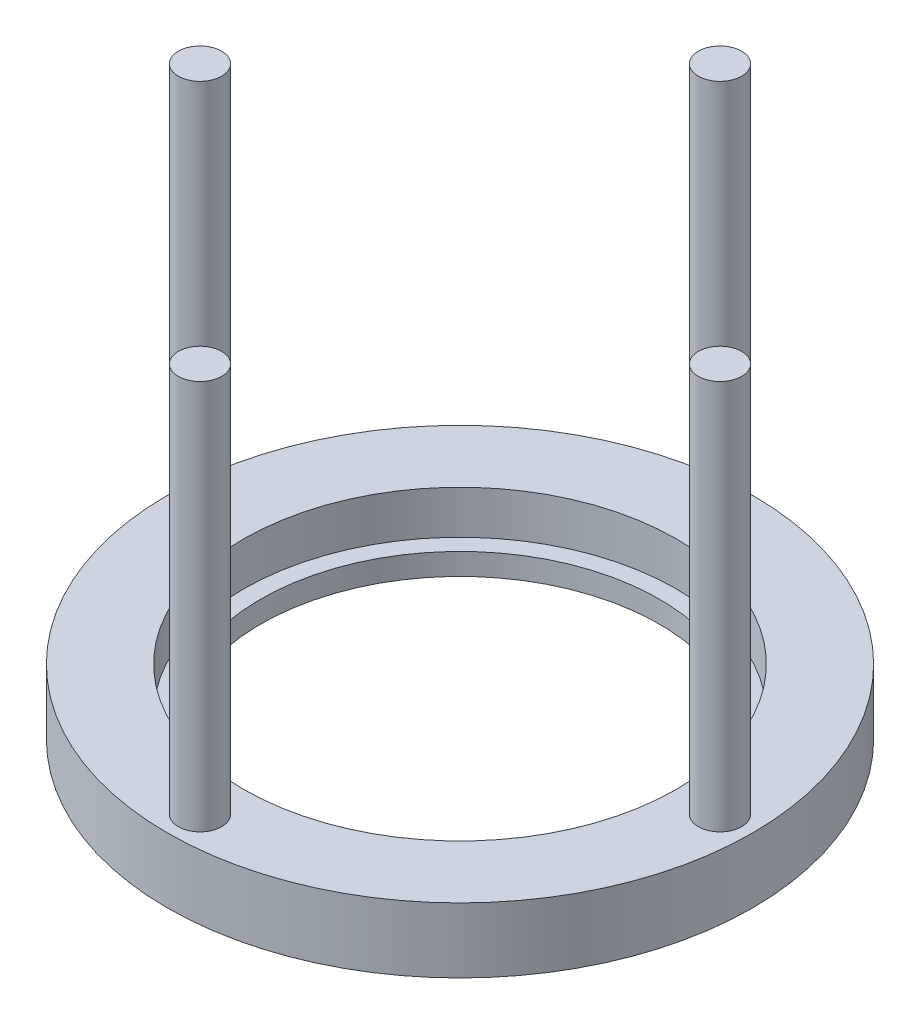
ISO-10303-21;
HEADER;
FILE_DESCRIPTION(('STEP AP214'),'2;1');
FILE_NAME('part.step','',(''),(''),'','','');
FILE_SCHEMA(('AUTOMOTIVE_DESIGN { 1 0 10303 214 1 1 1 1 }'));
ENDSEC;
DATA;
#1=APPLICATION_CONTEXT('core data for automotive mechanical design processes');
#2=APPLICATION_PROTOCOL_DEFINITION('international standard','automotive_design',2000,#1);
#3=PRODUCT_CONTEXT('',#1,'mechanical');
#4=PRODUCT('Part','Part','',(#3));
#5=PRODUCT_RELATED_PRODUCT_CATEGORY('part','',(#4));
#6=PRODUCT_DEFINITION_FORMATION('','',#4);
#7=PRODUCT_DEFINITION_CONTEXT('part definition',#1,'design');
#8=PRODUCT_DEFINITION('design','',#6,#7);
#9=PRODUCT_DEFINITION_SHAPE('','',#8);
#10=(LENGTH_UNIT() NAMED_UNIT(*) SI_UNIT(.MILLI.,.METRE.));
#11=(NAMED_UNIT(*) PLANE_ANGLE_UNIT() SI_UNIT($,.RADIAN.));
#12=(NAMED_UNIT(*) SI_UNIT($,.STERADIAN.) SOLID_ANGLE_UNIT());
#13=UNCERTAINTY_MEASURE_WITH_UNIT(LENGTH_MEASURE(1.E-05),#10,'distance_accuracy_value','');
#14=(GEOMETRIC_REPRESENTATION_CONTEXT(3) GLOBAL_UNCERTAINTY_ASSIGNED_CONTEXT((#13)) GLOBAL_UNIT_ASSIGNED_CONTEXT((#10,
#11,#12)) REPRESENTATION_CONTEXT('',''));
#15=CARTESIAN_POINT('',(0.,0.,0.));
#16=DIRECTION('',(0.,0.,1.));
#17=DIRECTION('',(1.,0.,0.));
#18=AXIS2_PLACEMENT_3D('',#15,#16,#17);
#19=CARTESIAN_POINT('',(0.,7.5,0.));
#20=DIRECTION('',(0.,-1.,0.));
#21=DIRECTION('',(0.,0.,-1.));
#22=AXIS2_PLACEMENT_3D('',#19,#20,#21);
#23=CYLINDRICAL_SURFACE('',#22,33.75);
#24=CARTESIAN_POINT('',(0.,7.5,0.));
#25=DIRECTION('',(0.,1.,0.));
#26=DIRECTION('',(0.,0.,1.));
#27=AXIS2_PLACEMENT_3D('',#24,#25,#26);
#28=CIRCLE('',#27,33.75);
#29=CARTESIAN_POINT('',(0.,7.5,33.75));
#30=VERTEX_POINT('',#29);
#31=EDGE_CURVE('E10',#30,#30,#28,.T.);
#32=ORIENTED_EDGE('',*,*,#31,.F.);
#33=EDGE_LOOP('',(#32));
#34=FACE_BOUND('',#33,.T.);
#35=CARTESIAN_POINT('',(0.,0.,0.));
#36=DIRECTION('',(0.,1.,0.));
#37=DIRECTION('',(0.,0.,1.));
#38=AXIS2_PLACEMENT_3D('',#35,#36,#37);
#39=CIRCLE('',#38,33.75);
#40=CARTESIAN_POINT('',(0.,0.,33.75));
#41=VERTEX_POINT('',#40);
#42=EDGE_CURVE('E40',#41,#41,#39,.T.);
#43=ORIENTED_EDGE('',*,*,#42,.T.);
#44=EDGE_LOOP('',(#43));
#45=FACE_BOUND('',#44,.T.);
#46=ADVANCED_FACE('F37',(#34,#45),#23,.T.);
#47=CARTESIAN_POINT('',(0.,7.5,0.));
#48=DIRECTION('',(0.,1.,0.));
#49=DIRECTION('',(0.,0.,1.));
#50=AXIS2_PLACEMENT_3D('',#47,#48,#49);
#51=PLANE('',#50);
#52=CARTESIAN_POINT('',(0.,7.5,0.));
#53=DIRECTION('',(0.,1.,0.));
#54=DIRECTION('',(0.,0.,1.));
#55=AXIS2_PLACEMENT_3D('',#52,#53,#54);
#56=CIRCLE('',#55,25.);
#57=CARTESIAN_POINT('',(0.,7.5,25.));
#58=VERTEX_POINT('',#57);
#59=EDGE_CURVE('E83',#58,#58,#56,.T.);
#60=ORIENTED_EDGE('',*,*,#59,.F.);
#61=EDGE_LOOP('',(#60));
#62=FACE_BOUND('',#61,.T.);
#63=CARTESIAN_POINT('',(0.,7.5,-30.));
#64=DIRECTION('',(0.,1.,0.));
#65=DIRECTION('',(0.,0.,1.));
#66=AXIS2_PLACEMENT_3D('',#63,#64,#65);
#67=CIRCLE('',#66,2.5);
#68=CARTESIAN_POINT('',(0.,7.49999999999999,-32.5));
#69=VERTEX_POINT('',#68);
#70=EDGE_CURVE('E75',#69,#69,#67,.T.);
#71=ORIENTED_EDGE('',*,*,#70,.F.);
#72=EDGE_LOOP('',(#71));
#73=FACE_BOUND('',#72,.T.);
#74=CARTESIAN_POINT('',(0.,7.5,30.));
#75=DIRECTION('',(0.,1.,0.));
#76=DIRECTION('',(0.,0.,-1.));
#77=AXIS2_PLACEMENT_3D('',#74,#75,#76);
#78=CIRCLE('',#77,2.5);
#79=CARTESIAN_POINT('',(0.,7.49999999999999,27.5));
#80=VERTEX_POINT('',#79);
#81=EDGE_CURVE('E67',#80,#80,#78,.T.);
#82=ORIENTED_EDGE('',*,*,#81,.F.);
#83=EDGE_LOOP('',(#82));
#84=FACE_BOUND('',#83,.T.);
#85=CARTESIAN_POINT('',(30.,7.5,0.));
#86=DIRECTION('',(0.,1.,0.));
#87=DIRECTION('',(0.,0.,-1.));
#88=AXIS2_PLACEMENT_3D('',#85,#86,#87);
#89=CIRCLE('',#88,2.49999999999999);
#90=CARTESIAN_POINT('',(30.,7.49999999999999,-2.5));
#91=VERTEX_POINT('',#90);
#92=EDGE_CURVE('E59',#91,#91,#89,.T.);
#93=ORIENTED_EDGE('',*,*,#92,.F.);
#94=EDGE_LOOP('',(#93));
#95=FACE_BOUND('',#94,.T.);
#96=CARTESIAN_POINT('',(-30.,7.5,0.));
#97=DIRECTION('',(0.,1.,0.));
#98=DIRECTION('',(0.,0.,1.));
#99=AXIS2_PLACEMENT_3D('',#96,#97,#98);
#100=CIRCLE('',#99,2.5);
#101=CARTESIAN_POINT('',(-30.,7.49999999999999,-2.5));
#102=VERTEX_POINT('',#101);
#103=EDGE_CURVE('E51',#102,#102,#100,.T.);
#104=ORIENTED_EDGE('',*,*,#103,.F.);
#105=EDGE_LOOP('',(#104));
#106=FACE_BOUND('',#105,.T.);
#107=ORIENTED_EDGE('',*,*,#31,.T.);
#108=EDGE_LOOP('',(#107));
#109=FACE_BOUND('',#108,.T.);
#110=ADVANCED_FACE('F121',(#62,#73,#84,#95,#106,#109),#51,.T.);
#111=CARTESIAN_POINT('',(0.,0.,0.));
#112=DIRECTION('',(0.,1.,0.));
#113=DIRECTION('',(0.,0.,1.));
#114=AXIS2_PLACEMENT_3D('',#111,#112,#113);
#115=PLANE('',#114);
#116=CARTESIAN_POINT('',(0.,0.,0.));
#117=DIRECTION('',(0.,1.,0.));
#118=DIRECTION('',(0.,0.,1.));
#119=AXIS2_PLACEMENT_3D('',#116,#117,#118);
#120=CIRCLE('',#119,23.);
#121=CARTESIAN_POINT('',(0.,0.,23.));
#122=VERTEX_POINT('',#121);
#123=EDGE_CURVE('E87',#122,#122,#120,.T.);
#124=ORIENTED_EDGE('',*,*,#123,.T.);
#125=EDGE_LOOP('',(#124));
#126=FACE_BOUND('',#125,.T.);
#127=ORIENTED_EDGE('',*,*,#42,.F.);
#128=EDGE_LOOP('',(#127));
#129=FACE_BOUND('',#128,.T.);
#130=ADVANCED_FACE('F99',(#126,#129),#115,.F.);
#131=CARTESIAN_POINT('',(-30.,52.5,0.));
#132=DIRECTION('',(0.,-1.,0.));
#133=DIRECTION('',(0.,0.,-1.));
#134=AXIS2_PLACEMENT_3D('',#131,#132,#133);
#135=CYLINDRICAL_SURFACE('',#134,2.5);
#136=CARTESIAN_POINT('',(-30.,52.5,0.));
#137=DIRECTION('',(0.,1.,0.));
#138=DIRECTION('',(0.,0.,1.));
#139=AXIS2_PLACEMENT_3D('',#136,#137,#138);
#140=CIRCLE('',#139,2.5);
#141=CARTESIAN_POINT('',(-30.,52.5,-2.5));
#142=VERTEX_POINT('',#141);
#143=EDGE_CURVE('E49',#142,#142,#140,.T.);
#144=CARTESIAN_POINT('',(-30.,52.5,-2.5));
#145=CARTESIAN_POINT('',(-30.,52.03125,-2.5));
#146=CARTESIAN_POINT('',(-30.,51.5625,-2.5));
#147=CARTESIAN_POINT('',(-30.,50.625,-2.5));
#148=CARTESIAN_POINT('',(-30.,50.15625,-2.5));
#149=CARTESIAN_POINT('',(-30.,49.21875,-2.5));
#150=CARTESIAN_POINT('',(-30.,48.75,-2.5));
#151=CARTESIAN_POINT('',(-30.,47.8125,-2.5));
#152=CARTESIAN_POINT('',(-30.,47.34375,-2.5));
#153=CARTESIAN_POINT('',(-30.,46.40625,-2.5));
#154=CARTESIAN_POINT('',(-30.,45.9375,-2.5));
#155=CARTESIAN_POINT('',(-30.,45.,-2.5));
#156=CARTESIAN_POINT('',(-30.,44.53125,-2.5));
#157=CARTESIAN_POINT('',(-30.,43.59375,-2.5));
#158=CARTESIAN_POINT('',(-30.,43.125,-2.5));
#159=CARTESIAN_POINT('',(-30.,42.1875,-2.5));
#160=CARTESIAN_POINT('',(-30.,41.71875,-2.5));
#161=CARTESIAN_POINT('',(-30.,40.78125,-2.5));
#162=CARTESIAN_POINT('',(-30.,40.3125,-2.5));
#163=CARTESIAN_POINT('',(-30.,39.375,-2.5));
#164=CARTESIAN_POINT('',(-30.,38.90625,-2.5));
#165=CARTESIAN_POINT('',(-30.,37.96875,-2.5));
#166=CARTESIAN_POINT('',(-30.,37.5,-2.5));
#167=CARTESIAN_POINT('',(-30.,36.5625,-2.5));
#168=CARTESIAN_POINT('',(-30.,36.09375,-2.5));
#169=CARTESIAN_POINT('',(-30.,35.15625,-2.5));
#170=CARTESIAN_POINT('',(-30.,34.6875,-2.5));
#171=CARTESIAN_POINT('',(-30.,33.75,-2.5));
#172=CARTESIAN_POINT('',(-30.,33.28125,-2.5));
#173=CARTESIAN_POINT('',(-30.,32.34375,-2.5));
#174=CARTESIAN_POINT('',(-30.,31.875,-2.5));
#175=CARTESIAN_POINT('',(-30.,30.9375,-2.5));
#176=CARTESIAN_POINT('',(-30.,30.46875,-2.5));
#177=CARTESIAN_POINT('',(-30.,29.53125,-2.5));
#178=CARTESIAN_POINT('',(-30.,29.0625,-2.5));
#179=CARTESIAN_POINT('',(-30.,28.125,-2.5));
#180=CARTESIAN_POINT('',(-30.,27.65625,-2.5));
#181=CARTESIAN_POINT('',(-30.,26.71875,-2.5));
#182=CARTESIAN_POINT('',(-30.,26.25,-2.5));
#183=CARTESIAN_POINT('',(-30.,25.3125,-2.5));
#184=CARTESIAN_POINT('',(-30.,24.84375,-2.5));
#185=CARTESIAN_POINT('',(-30.,23.90625,-2.5));
#186=CARTESIAN_POINT('',(-30.,23.4375,-2.5));
#187=CARTESIAN_POINT('',(-30.,22.5,-2.5));
#188=CARTESIAN_POINT('',(-30.,22.03125,-2.5));
#189=CARTESIAN_POINT('',(-30.,21.09375,-2.5));
#190=CARTESIAN_POINT('',(-30.,20.625,-2.5));
#191=CARTESIAN_POINT('',(-30.,19.6875,-2.5));
#192=CARTESIAN_POINT('',(-30.,19.21875,-2.5));
#193=CARTESIAN_POINT('',(-30.,18.28125,-2.5));
#194=CARTESIAN_POINT('',(-30.,17.8125,-2.5));
#195=CARTESIAN_POINT('',(-30.,16.875,-2.5));
#196=CARTESIAN_POINT('',(-30.,16.40625,-2.5));
#197=CARTESIAN_POINT('',(-30.,15.46875,-2.5));
#198=CARTESIAN_POINT('',(-30.,15.,-2.5));
#199=CARTESIAN_POINT('',(-30.,14.0625,-2.5));
#200=CARTESIAN_POINT('',(-30.,13.59375,-2.5));
#201=CARTESIAN_POINT('',(-30.,12.65625,-2.5));
#202=CARTESIAN_POINT('',(-30.,12.1875,-2.5));
#203=CARTESIAN_POINT('',(-30.,11.25,-2.5));
#204=CARTESIAN_POINT('',(-30.,10.78125,-2.5));
#205=CARTESIAN_POINT('',(-30.,9.84374999999999,-2.5));
#206=CARTESIAN_POINT('',(-30.,9.37499999999999,-2.5));
#207=CARTESIAN_POINT('',(-30.,8.43749999999999,-2.5));
#208=CARTESIAN_POINT('',(-30.,7.96874999999999,-2.5));
#209=CARTESIAN_POINT('',(-30.,7.49999999999999,-2.5));
#210=B_SPLINE_CURVE_WITH_KNOTS('',3,(#144,#145,#146,#147,#148,#149,#150,#151,#152,#153,#154,
#155,#156,#157,#158,#159,#160,#161,#162,#163,#164,#165,#166,#167,#168,#169,#170,#171,#172,#173,
#174,#175,#176,#177,#178,#179,#180,#181,#182,#183,#184,#185,#186,#187,#188,#189,#190,#191,#192,
#193,#194,#195,#196,#197,#198,#199,#200,#201,#202,#203,#204,#205,#206,#207,#208,#209),
.UNSPECIFIED.,.F.,.F.,(4,2,2,2,2,2,2,2,2,2,2,2,2,2,2,2,2,2,2,2,2,2,2,2,2,2,2,2,2,2,2,2,4),(0.,
1.40625,2.8125,4.21874999999999,5.625,7.03125,8.43749999999999,9.84375,11.25,12.65625,14.0625,
15.46875,16.875,18.28125,19.6875,21.09375,22.5,23.90625,25.3125,26.71875,28.125,29.53125,
30.9375,32.34375,33.75,35.15625,36.5625,37.96875,39.375,40.78125,42.1875,43.59375,45.),.UNSPECIFIED.);
#211=EDGE_CURVE('BSEAM133',#142,#102,#210,.T.);
#212=ORIENTED_EDGE('',*,*,#143,.F.);
#213=ORIENTED_EDGE('',*,*,#103,.T.);
#214=ORIENTED_EDGE('',*,*,#211,.T.);
#215=ORIENTED_EDGE('',*,*,#211,.F.);
#216=EDGE_LOOP('',(#212,#214,#213,#215));
#217=FACE_BOUND('',#216,.T.);
#218=ADVANCED_FACE('F133',(#217),#135,.T.);
#219=CARTESIAN_POINT('',(-30.,52.5,0.));
#220=DIRECTION('',(0.,1.,0.));
#221=DIRECTION('',(0.,0.,1.));
#222=AXIS2_PLACEMENT_3D('',#219,#220,#221);
#223=PLANE('',#222);
#224=ORIENTED_EDGE('',*,*,#143,.T.);
#225=EDGE_LOOP('',(#224));
#226=FACE_BOUND('',#225,.T.);
#227=ADVANCED_FACE('F135',(#226),#223,.T.);
#228=CARTESIAN_POINT('',(30.,52.5,0.));
#229=DIRECTION('',(0.,-1.,0.));
#230=DIRECTION('',(0.,0.,-1.));
#231=AXIS2_PLACEMENT_3D('',#228,#229,#230);
#232=CYLINDRICAL_SURFACE('',#231,2.49999999999999);
#233=CARTESIAN_POINT('',(30.,52.5,0.));
#234=DIRECTION('',(0.,1.,0.));
#235=DIRECTION('',(0.,0.,-1.));
#236=AXIS2_PLACEMENT_3D('',#233,#234,#235);
#237=CIRCLE('',#236,2.49999999999999);
#238=CARTESIAN_POINT('',(30.,52.5,-2.5));
#239=VERTEX_POINT('',#238);
#240=EDGE_CURVE('E55',#239,#239,#237,.T.);
#241=CARTESIAN_POINT('',(30.,52.5,-2.5));
#242=CARTESIAN_POINT('',(30.,52.03125,-2.5));
#243=CARTESIAN_POINT('',(30.,51.5625,-2.5));
#244=CARTESIAN_POINT('',(30.,50.625,-2.5));
#245=CARTESIAN_POINT('',(30.,50.15625,-2.5));
#246=CARTESIAN_POINT('',(30.,49.21875,-2.5));
#247=CARTESIAN_POINT('',(30.,48.75,-2.5));
#248=CARTESIAN_POINT('',(30.,47.8125,-2.5));
#249=CARTESIAN_POINT('',(30.,47.34375,-2.5));
#250=CARTESIAN_POINT('',(30.,46.40625,-2.5));
#251=CARTESIAN_POINT('',(30.,45.9375,-2.5));
#252=CARTESIAN_POINT('',(30.,45.,-2.5));
#253=CARTESIAN_POINT('',(30.,44.53125,-2.5));
#254=CARTESIAN_POINT('',(30.,43.59375,-2.5));
#255=CARTESIAN_POINT('',(30.,43.125,-2.5));
#256=CARTESIAN_POINT('',(30.,42.1875,-2.5));
#257=CARTESIAN_POINT('',(30.,41.71875,-2.5));
#258=CARTESIAN_POINT('',(30.,40.78125,-2.5));
#259=CARTESIAN_POINT('',(30.,40.3125,-2.5));
#260=CARTESIAN_POINT('',(30.,39.375,-2.5));
#261=CARTESIAN_POINT('',(30.,38.90625,-2.5));
#262=CARTESIAN_POINT('',(30.,37.96875,-2.5));
#263=CARTESIAN_POINT('',(30.,37.5,-2.5));
#264=CARTESIAN_POINT('',(30.,36.5625,-2.5));
#265=CARTESIAN_POINT('',(30.,36.09375,-2.5));
#266=CARTESIAN_POINT('',(30.,35.15625,-2.5));
#267=CARTESIAN_POINT('',(30.,34.6875,-2.5));
#268=CARTESIAN_POINT('',(30.,33.75,-2.5));
#269=CARTESIAN_POINT('',(30.,33.28125,-2.5));
#270=CARTESIAN_POINT('',(30.,32.34375,-2.5));
#271=CARTESIAN_POINT('',(30.,31.875,-2.5));
#272=CARTESIAN_POINT('',(30.,30.9375,-2.5));
#273=CARTESIAN_POINT('',(30.,30.46875,-2.5));
#274=CARTESIAN_POINT('',(30.,29.53125,-2.5));
#275=CARTESIAN_POINT('',(30.,29.0625,-2.5));
#276=CARTESIAN_POINT('',(30.,28.125,-2.5));
#277=CARTESIAN_POINT('',(30.,27.65625,-2.5));
#278=CARTESIAN_POINT('',(30.,26.71875,-2.5));
#279=CARTESIAN_POINT('',(30.,26.25,-2.5));
#280=CARTESIAN_POINT('',(30.,25.3125,-2.5));
#281=CARTESIAN_POINT('',(30.,24.84375,-2.5));
#282=CARTESIAN_POINT('',(30.,23.90625,-2.5));
#283=CARTESIAN_POINT('',(30.,23.4375,-2.5));
#284=CARTESIAN_POINT('',(30.,22.5,-2.5));
#285=CARTESIAN_POINT('',(30.,22.03125,-2.5));
#286=CARTESIAN_POINT('',(30.,21.09375,-2.5));
#287=CARTESIAN_POINT('',(30.,20.625,-2.5));
#288=CARTESIAN_POINT('',(30.,19.6875,-2.5));
#289=CARTESIAN_POINT('',(30.,19.21875,-2.5));
#290=CARTESIAN_POINT('',(30.,18.28125,-2.5));
#291=CARTESIAN_POINT('',(30.,17.8125,-2.5));
#292=CARTESIAN_POINT('',(30.,16.875,-2.5));
#293=CARTESIAN_POINT('',(30.,16.40625,-2.5));
#294=CARTESIAN_POINT('',(30.,15.46875,-2.5));
#295=CARTESIAN_POINT('',(30.,15.,-2.5));
#296=CARTESIAN_POINT('',(30.,14.0625,-2.5));
#297=CARTESIAN_POINT('',(30.,13.59375,-2.5));
#298=CARTESIAN_POINT('',(30.,12.65625,-2.5));
#299=CARTESIAN_POINT('',(30.,12.1875,-2.5));
#300=CARTESIAN_POINT('',(30.,11.25,-2.5));
#301=CARTESIAN_POINT('',(30.,10.78125,-2.5));
#302=CARTESIAN_POINT('',(30.,9.84374999999999,-2.5));
#303=CARTESIAN_POINT('',(30.,9.37499999999999,-2.5));
#304=CARTESIAN_POINT('',(30.,8.43749999999999,-2.5));
#305=CARTESIAN_POINT('',(30.,7.96874999999999,-2.5));
#306=CARTESIAN_POINT('',(30.,7.49999999999999,-2.5));
#307=B_SPLINE_CURVE_WITH_KNOTS('',3,(#241,#242,#243,#244,#245,#246,#247,#248,#249,#250,#251,
#252,#253,#254,#255,#256,#257,#258,#259,#260,#261,#262,#263,#264,#265,#266,#267,#268,#269,#270,
#271,#272,#273,#274,#275,#276,#277,#278,#279,#280,#281,#282,#283,#284,#285,#286,#287,#288,#289,
#290,#291,#292,#293,#294,#295,#296,#297,#298,#299,#300,#301,#302,#303,#304,#305,#306),
.UNSPECIFIED.,.F.,.F.,(4,2,2,2,2,2,2,2,2,2,2,2,2,2,2,2,2,2,2,2,2,2,2,2,2,2,2,2,2,2,2,2,4),(0.,
1.40625,2.8125,4.21874999999999,5.625,7.03125,8.43749999999999,9.84375,11.25,12.65625,14.0625,
15.46875,16.875,18.28125,19.6875,21.09375,22.5,23.90625,25.3125,26.71875,28.125,29.53125,
30.9375,32.34375,33.75,35.15625,36.5625,37.96875,39.375,40.78125,42.1875,43.59375,45.),.UNSPECIFIED.);
#308=EDGE_CURVE('BSEAM142',#239,#91,#307,.T.);
#309=ORIENTED_EDGE('',*,*,#240,.F.);
#310=ORIENTED_EDGE('',*,*,#92,.T.);
#311=ORIENTED_EDGE('',*,*,#308,.T.);
#312=ORIENTED_EDGE('',*,*,#308,.F.);
#313=EDGE_LOOP('',(#309,#311,#310,#312));
#314=FACE_BOUND('',#313,.T.);
#315=ADVANCED_FACE('F142',(#314),#232,.T.);
#316=CARTESIAN_POINT('',(30.,52.5,0.));
#317=DIRECTION('',(0.,-1.,0.));
#318=DIRECTION('',(0.,0.,-1.));
#319=AXIS2_PLACEMENT_3D('',#316,#317,#318);
#320=PLANE('',#319);
#321=ORIENTED_EDGE('',*,*,#240,.T.);
#322=EDGE_LOOP('',(#321));
#323=FACE_BOUND('',#322,.T.);
#324=ADVANCED_FACE('F209',(#323),#320,.F.);
#325=CARTESIAN_POINT('',(0.,52.5,30.));
#326=DIRECTION('',(0.,-1.,0.));
#327=DIRECTION('',(0.,0.,-1.));
#328=AXIS2_PLACEMENT_3D('',#325,#326,#327);
#329=CYLINDRICAL_SURFACE('',#328,2.5);
#330=CARTESIAN_POINT('',(0.,52.5,30.));
#331=DIRECTION('',(0.,1.,0.));
#332=DIRECTION('',(0.,0.,-1.));
#333=AXIS2_PLACEMENT_3D('',#330,#331,#332);
#334=CIRCLE('',#333,2.5);
#335=CARTESIAN_POINT('',(0.,52.5,27.5));
#336=VERTEX_POINT('',#335);
#337=EDGE_CURVE('E63',#336,#336,#334,.T.);
#338=CARTESIAN_POINT('',(0.,52.5,27.5));
#339=CARTESIAN_POINT('',(0.,52.03125,27.5));
#340=CARTESIAN_POINT('',(0.,51.5625,27.5));
#341=CARTESIAN_POINT('',(0.,50.625,27.5));
#342=CARTESIAN_POINT('',(0.,50.15625,27.5));
#343=CARTESIAN_POINT('',(0.,49.21875,27.5));
#344=CARTESIAN_POINT('',(0.,48.75,27.5));
#345=CARTESIAN_POINT('',(0.,47.8125,27.5));
#346=CARTESIAN_POINT('',(0.,47.34375,27.5));
#347=CARTESIAN_POINT('',(0.,46.40625,27.5));
#348=CARTESIAN_POINT('',(0.,45.9375,27.5));
#349=CARTESIAN_POINT('',(0.,45.,27.5));
#350=CARTESIAN_POINT('',(0.,44.53125,27.5));
#351=CARTESIAN_POINT('',(0.,43.59375,27.5));
#352=CARTESIAN_POINT('',(0.,43.125,27.5));
#353=CARTESIAN_POINT('',(0.,42.1875,27.5));
#354=CARTESIAN_POINT('',(0.,41.71875,27.5));
#355=CARTESIAN_POINT('',(0.,40.78125,27.5));
#356=CARTESIAN_POINT('',(0.,40.3125,27.5));
#357=CARTESIAN_POINT('',(0.,39.375,27.5));
#358=CARTESIAN_POINT('',(0.,38.90625,27.5));
#359=CARTESIAN_POINT('',(0.,37.96875,27.5));
#360=CARTESIAN_POINT('',(0.,37.5,27.5));
#361=CARTESIAN_POINT('',(0.,36.5625,27.5));
#362=CARTESIAN_POINT('',(0.,36.09375,27.5));
#363=CARTESIAN_POINT('',(0.,35.15625,27.5));
#364=CARTESIAN_POINT('',(0.,34.6875,27.5));
#365=CARTESIAN_POINT('',(0.,33.75,27.5));
#366=CARTESIAN_POINT('',(0.,33.28125,27.5));
#367=CARTESIAN_POINT('',(0.,32.34375,27.5));
#368=CARTESIAN_POINT('',(0.,31.875,27.5));
#369=CARTESIAN_POINT('',(0.,30.9375,27.5));
#370=CARTESIAN_POINT('',(0.,30.46875,27.5));
#371=CARTESIAN_POINT('',(0.,29.53125,27.5));
#372=CARTESIAN_POINT('',(0.,29.0625,27.5));
#373=CARTESIAN_POINT('',(0.,28.125,27.5));
#374=CARTESIAN_POINT('',(0.,27.65625,27.5));
#375=CARTESIAN_POINT('',(0.,26.71875,27.5));
#376=CARTESIAN_POINT('',(0.,26.25,27.5));
#377=CARTESIAN_POINT('',(0.,25.3125,27.5));
#378=CARTESIAN_POINT('',(0.,24.84375,27.5));
#379=CARTESIAN_POINT('',(0.,23.90625,27.5));
#380=CARTESIAN_POINT('',(0.,23.4375,27.5));
#381=CARTESIAN_POINT('',(0.,22.5,27.5));
#382=CARTESIAN_POINT('',(0.,22.03125,27.5));
#383=CARTESIAN_POINT('',(0.,21.09375,27.5));
#384=CARTESIAN_POINT('',(0.,20.625,27.5));
#385=CARTESIAN_POINT('',(0.,19.6875,27.5));
#386=CARTESIAN_POINT('',(0.,19.21875,27.5));
#387=CARTESIAN_POINT('',(0.,18.28125,27.5));
#388=CARTESIAN_POINT('',(0.,17.8125,27.5));
#389=CARTESIAN_POINT('',(0.,16.875,27.5));
#390=CARTESIAN_POINT('',(0.,16.40625,27.5));
#391=CARTESIAN_POINT('',(0.,15.46875,27.5));
#392=CARTESIAN_POINT('',(0.,15.,27.5));
#393=CARTESIAN_POINT('',(0.,14.0625,27.5));
#394=CARTESIAN_POINT('',(0.,13.59375,27.5));
#395=CARTESIAN_POINT('',(0.,12.65625,27.5));
#396=CARTESIAN_POINT('',(0.,12.1875,27.5));
#397=CARTESIAN_POINT('',(0.,11.25,27.5));
#398=CARTESIAN_POINT('',(0.,10.78125,27.5));
#399=CARTESIAN_POINT('',(0.,9.84374999999999,27.5));
#400=CARTESIAN_POINT('',(0.,9.37499999999999,27.5));
#401=CARTESIAN_POINT('',(0.,8.43749999999999,27.5));
#402=CARTESIAN_POINT('',(0.,7.96874999999999,27.5));
#403=CARTESIAN_POINT('',(0.,7.49999999999999,27.5));
#404=B_SPLINE_CURVE_WITH_KNOTS('',3,(#338,#339,#340,#341,#342,#343,#344,#345,#346,#347,#348,
#349,#350,#351,#352,#353,#354,#355,#356,#357,#358,#359,#360,#361,#362,#363,#364,#365,#366,#367,
#368,#369,#370,#371,#372,#373,#374,#375,#376,#377,#378,#379,#380,#381,#382,#383,#384,#385,#386,
#387,#388,#389,#390,#391,#392,#393,#394,#395,#396,#397,#398,#399,#400,#401,#402,#403),
.UNSPECIFIED.,.F.,.F.,(4,2,2,2,2,2,2,2,2,2,2,2,2,2,2,2,2,2,2,2,2,2,2,2,2,2,2,2,2,2,2,2,4),(0.,
1.40625,2.8125,4.21874999999999,5.625,7.03125,8.43749999999999,9.84375,11.25,12.65625,14.0625,
15.46875,16.875,18.28125,19.6875,21.09375,22.5,23.90625,25.3125,26.71875,28.125,29.53125,
30.9375,32.34375,33.75,35.15625,36.5625,37.96875,39.375,40.78125,42.1875,43.59375,45.),.UNSPECIFIED.);
#405=EDGE_CURVE('BSEAM201',#336,#80,#404,.T.);
#406=ORIENTED_EDGE('',*,*,#337,.F.);
#407=ORIENTED_EDGE('',*,*,#81,.T.);
#408=ORIENTED_EDGE('',*,*,#405,.T.);
#409=ORIENTED_EDGE('',*,*,#405,.F.);
#410=EDGE_LOOP('',(#406,#408,#407,#409));
#411=FACE_BOUND('',#410,.T.);
#412=ADVANCED_FACE('F201',(#411),#329,.T.);
#413=CARTESIAN_POINT('',(0.,52.5,30.));
#414=DIRECTION('',(0.,-1.,0.));
#415=DIRECTION('',(0.,0.,-1.));
#416=AXIS2_PLACEMENT_3D('',#413,#414,#415);
#417=PLANE('',#416);
#418=ORIENTED_EDGE('',*,*,#337,.T.);
#419=EDGE_LOOP('',(#418));
#420=FACE_BOUND('',#419,.T.);
#421=ADVANCED_FACE('F193',(#420),#417,.F.);
#422=CARTESIAN_POINT('',(0.,52.5,-30.));
#423=DIRECTION('',(0.,-1.,0.));
#424=DIRECTION('',(0.,0.,-1.));
#425=AXIS2_PLACEMENT_3D('',#422,#423,#424);
#426=CYLINDRICAL_SURFACE('',#425,2.5);
#427=CARTESIAN_POINT('',(0.,52.5,-30.));
#428=DIRECTION('',(0.,1.,0.));
#429=DIRECTION('',(0.,0.,1.));
#430=AXIS2_PLACEMENT_3D('',#427,#428,#429);
#431=CIRCLE('',#430,2.5);
#432=CARTESIAN_POINT('',(0.,52.5,-32.5));
#433=VERTEX_POINT('',#432);
#434=EDGE_CURVE('E71',#433,#433,#431,.T.);
#435=CARTESIAN_POINT('',(0.,52.5,-32.5));
#436=CARTESIAN_POINT('',(0.,52.03125,-32.5));
#437=CARTESIAN_POINT('',(0.,51.5625,-32.5));
#438=CARTESIAN_POINT('',(0.,50.625,-32.5));
#439=CARTESIAN_POINT('',(0.,50.15625,-32.5));
#440=CARTESIAN_POINT('',(0.,49.21875,-32.5));
#441=CARTESIAN_POINT('',(0.,48.75,-32.5));
#442=CARTESIAN_POINT('',(0.,47.8125,-32.5));
#443=CARTESIAN_POINT('',(0.,47.34375,-32.5));
#444=CARTESIAN_POINT('',(0.,46.40625,-32.5));
#445=CARTESIAN_POINT('',(0.,45.9375,-32.5));
#446=CARTESIAN_POINT('',(0.,45.,-32.5));
#447=CARTESIAN_POINT('',(0.,44.53125,-32.5));
#448=CARTESIAN_POINT('',(0.,43.59375,-32.5));
#449=CARTESIAN_POINT('',(0.,43.125,-32.5));
#450=CARTESIAN_POINT('',(0.,42.1875,-32.5));
#451=CARTESIAN_POINT('',(0.,41.71875,-32.5));
#452=CARTESIAN_POINT('',(0.,40.78125,-32.5));
#453=CARTESIAN_POINT('',(0.,40.3125,-32.5));
#454=CARTESIAN_POINT('',(0.,39.375,-32.5));
#455=CARTESIAN_POINT('',(0.,38.90625,-32.5));
#456=CARTESIAN_POINT('',(0.,37.96875,-32.5));
#457=CARTESIAN_POINT('',(0.,37.5,-32.5));
#458=CARTESIAN_POINT('',(0.,36.5625,-32.5));
#459=CARTESIAN_POINT('',(0.,36.09375,-32.5));
#460=CARTESIAN_POINT('',(0.,35.15625,-32.5));
#461=CARTESIAN_POINT('',(0.,34.6875,-32.5));
#462=CARTESIAN_POINT('',(0.,33.75,-32.5));
#463=CARTESIAN_POINT('',(0.,33.28125,-32.5));
#464=CARTESIAN_POINT('',(0.,32.34375,-32.5));
#465=CARTESIAN_POINT('',(0.,31.875,-32.5));
#466=CARTESIAN_POINT('',(0.,30.9375,-32.5));
#467=CARTESIAN_POINT('',(0.,30.46875,-32.5));
#468=CARTESIAN_POINT('',(0.,29.53125,-32.5));
#469=CARTESIAN_POINT('',(0.,29.0625,-32.5));
#470=CARTESIAN_POINT('',(0.,28.125,-32.5));
#471=CARTESIAN_POINT('',(0.,27.65625,-32.5));
#472=CARTESIAN_POINT('',(0.,26.71875,-32.5));
#473=CARTESIAN_POINT('',(0.,26.25,-32.5));
#474=CARTESIAN_POINT('',(0.,25.3125,-32.5));
#475=CARTESIAN_POINT('',(0.,24.84375,-32.5));
#476=CARTESIAN_POINT('',(0.,23.90625,-32.5));
#477=CARTESIAN_POINT('',(0.,23.4375,-32.5));
#478=CARTESIAN_POINT('',(0.,22.5,-32.5));
#479=CARTESIAN_POINT('',(0.,22.03125,-32.5));
#480=CARTESIAN_POINT('',(0.,21.09375,-32.5));
#481=CARTESIAN_POINT('',(0.,20.625,-32.5));
#482=CARTESIAN_POINT('',(0.,19.6875,-32.5));
#483=CARTESIAN_POINT('',(0.,19.21875,-32.5));
#484=CARTESIAN_POINT('',(0.,18.28125,-32.5));
#485=CARTESIAN_POINT('',(0.,17.8125,-32.5));
#486=CARTESIAN_POINT('',(0.,16.875,-32.5));
#487=CARTESIAN_POINT('',(0.,16.40625,-32.5));
#488=CARTESIAN_POINT('',(0.,15.46875,-32.5));
#489=CARTESIAN_POINT('',(0.,15.,-32.5));
#490=CARTESIAN_POINT('',(0.,14.0625,-32.5));
#491=CARTESIAN_POINT('',(0.,13.59375,-32.5));
#492=CARTESIAN_POINT('',(0.,12.65625,-32.5));
#493=CARTESIAN_POINT('',(0.,12.1875,-32.5));
#494=CARTESIAN_POINT('',(0.,11.25,-32.5));
#495=CARTESIAN_POINT('',(0.,10.78125,-32.5));
#496=CARTESIAN_POINT('',(0.,9.84374999999999,-32.5));
#497=CARTESIAN_POINT('',(0.,9.37499999999999,-32.5));
#498=CARTESIAN_POINT('',(0.,8.43749999999999,-32.5));
#499=CARTESIAN_POINT('',(0.,7.96874999999999,-32.5));
#500=CARTESIAN_POINT('',(0.,7.49999999999999,-32.5));
#501=B_SPLINE_CURVE_WITH_KNOTS('',3,(#435,#436,#437,#438,#439,#440,#441,#442,#443,#444,#445,
#446,#447,#448,#449,#450,#451,#452,#453,#454,#455,#456,#457,#458,#459,#460,#461,#462,#463,#464,
#465,#466,#467,#468,#469,#470,#471,#472,#473,#474,#475,#476,#477,#478,#479,#480,#481,#482,#483,
#484,#485,#486,#487,#488,#489,#490,#491,#492,#493,#494,#495,#496,#497,#498,#499,#500),
.UNSPECIFIED.,.F.,.F.,(4,2,2,2,2,2,2,2,2,2,2,2,2,2,2,2,2,2,2,2,2,2,2,2,2,2,2,2,2,2,2,2,4),(0.,
1.40625,2.8125,4.21874999999999,5.625,7.03125,8.43749999999999,9.84375,11.25,12.65625,14.0625,
15.46875,16.875,18.28125,19.6875,21.09375,22.5,23.90625,25.3125,26.71875,28.125,29.53125,
30.9375,32.34375,33.75,35.15625,36.5625,37.96875,39.375,40.78125,42.1875,43.59375,45.),.UNSPECIFIED.);
#502=EDGE_CURVE('BSEAM185',#433,#69,#501,.T.);
#503=ORIENTED_EDGE('',*,*,#434,.F.);
#504=ORIENTED_EDGE('',*,*,#70,.T.);
#505=ORIENTED_EDGE('',*,*,#502,.T.);
#506=ORIENTED_EDGE('',*,*,#502,.F.);
#507=EDGE_LOOP('',(#503,#505,#504,#506));
#508=FACE_BOUND('',#507,.T.);
#509=ADVANCED_FACE('F185',(#508),#426,.T.);
#510=CARTESIAN_POINT('',(0.,52.5,-30.));
#511=DIRECTION('',(0.,1.,0.));
#512=DIRECTION('',(0.,0.,1.));
#513=AXIS2_PLACEMENT_3D('',#510,#511,#512);
#514=PLANE('',#513);
#515=ORIENTED_EDGE('',*,*,#434,.T.);
#516=EDGE_LOOP('',(#515));
#517=FACE_BOUND('',#516,.T.);
#518=ADVANCED_FACE('F117',(#517),#514,.T.);
#519=CARTESIAN_POINT('',(0.,2.5,0.));
#520=DIRECTION('',(0.,1.,0.));
#521=DIRECTION('',(0.,0.,1.));
#522=AXIS2_PLACEMENT_3D('',#519,#520,#521);
#523=CYLINDRICAL_SURFACE('',#522,25.);
#524=CARTESIAN_POINT('',(0.,2.5,0.));
#525=DIRECTION('',(0.,1.,0.));
#526=DIRECTION('',(0.,0.,1.));
#527=AXIS2_PLACEMENT_3D('',#524,#525,#526);
#528=CIRCLE('',#527,25.);
#529=CARTESIAN_POINT('',(0.,2.5,25.));
#530=VERTEX_POINT('',#529);
#531=EDGE_CURVE('E79',#530,#530,#528,.T.);
#532=ORIENTED_EDGE('',*,*,#531,.F.);
#533=EDGE_LOOP('',(#532));
#534=FACE_BOUND('',#533,.T.);
#535=ORIENTED_EDGE('',*,*,#59,.T.);
#536=EDGE_LOOP('',(#535));
#537=FACE_BOUND('',#536,.T.);
#538=ADVANCED_FACE('F111',(#534,#537),#523,.F.);
#539=CARTESIAN_POINT('',(0.,2.5,0.));
#540=DIRECTION('',(0.,1.,0.));
#541=DIRECTION('',(0.,0.,1.));
#542=AXIS2_PLACEMENT_3D('',#539,#540,#541);
#543=PLANE('',#542);
#544=CARTESIAN_POINT('',(0.,2.5,0.));
#545=DIRECTION('',(0.,1.,0.));
#546=DIRECTION('',(0.,0.,1.));
#547=AXIS2_PLACEMENT_3D('',#544,#545,#546);
#548=CIRCLE('',#547,23.);
#549=CARTESIAN_POINT('',(0.,2.5,23.));
#550=VERTEX_POINT('',#549);
#551=EDGE_CURVE('E91',#550,#550,#548,.T.);
#552=ORIENTED_EDGE('',*,*,#551,.F.);
#553=EDGE_LOOP('',(#552));
#554=FACE_BOUND('',#553,.T.);
#555=ORIENTED_EDGE('',*,*,#531,.T.);
#556=EDGE_LOOP('',(#555));
#557=FACE_BOUND('',#556,.T.);
#558=ADVANCED_FACE('F105',(#554,#557),#543,.T.);
#559=CARTESIAN_POINT('',(0.,0.,0.));
#560=DIRECTION('',(0.,1.,0.));
#561=DIRECTION('',(0.,0.,1.));
#562=AXIS2_PLACEMENT_3D('',#559,#560,#561);
#563=CYLINDRICAL_SURFACE('',#562,23.);
#564=ORIENTED_EDGE('',*,*,#123,.F.);
#565=EDGE_LOOP('',(#564));
#566=FACE_BOUND('',#565,.T.);
#567=ORIENTED_EDGE('',*,*,#551,.T.);
#568=EDGE_LOOP('',(#567));
#569=FACE_BOUND('',#568,.T.);
#570=ADVANCED_FACE('F102',(#566,#569),#563,.F.);
#571=CLOSED_SHELL('',(#46,#110,#130,#218,#227,#315,#324,#412,#421,#509,#518,#538,#558,#570));
#572=MANIFOLD_SOLID_BREP('B2',#571);
#573=ADVANCED_BREP_SHAPE_REPRESENTATION('',(#18,#572),#14);
#574=SHAPE_DEFINITION_REPRESENTATION(#9,#573);
ENDSEC;
END-ISO-10303-21;
